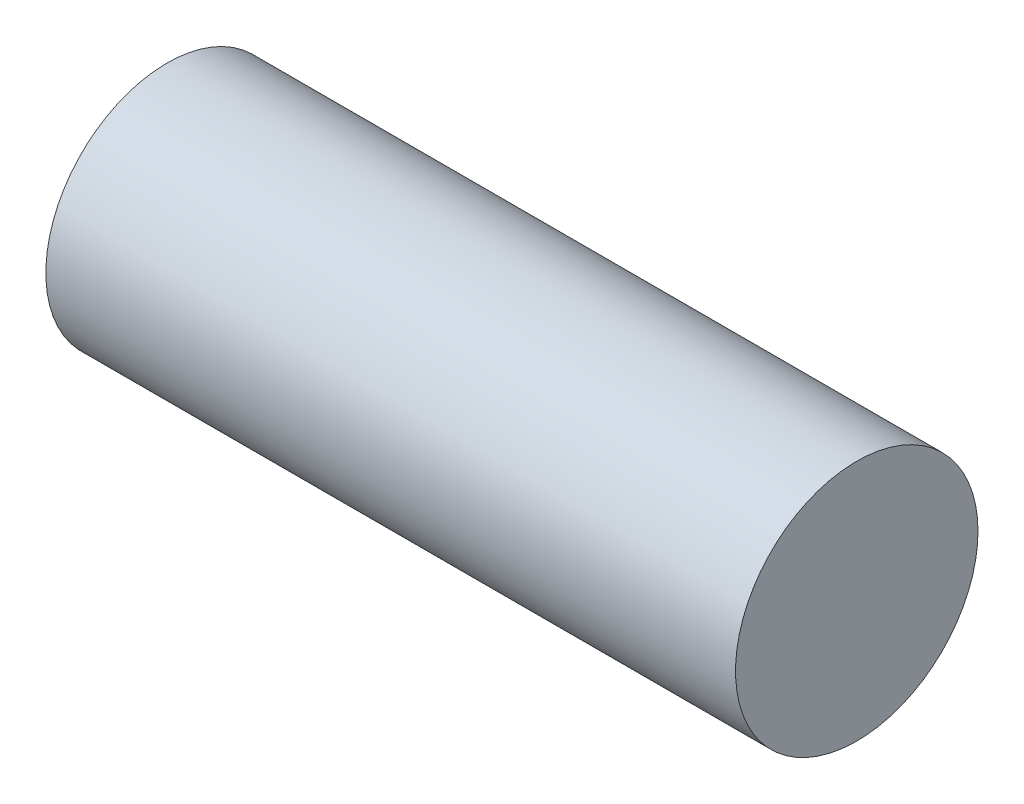
ISO-10303-21;
HEADER;
FILE_DESCRIPTION(('STEP AP214'),'2;1');
FILE_NAME('part.step','',(''),(''),'','','');
FILE_SCHEMA(('AUTOMOTIVE_DESIGN { 1 0 10303 214 1 1 1 1 }'));
ENDSEC;
DATA;
#1=APPLICATION_CONTEXT('core data for automotive mechanical design processes');
#2=APPLICATION_PROTOCOL_DEFINITION('international standard','automotive_design',2000,#1);
#3=PRODUCT_CONTEXT('',#1,'mechanical');
#4=PRODUCT('Part','Part','',(#3));
#5=PRODUCT_RELATED_PRODUCT_CATEGORY('part','',(#4));
#6=PRODUCT_DEFINITION_FORMATION('','',#4);
#7=PRODUCT_DEFINITION_CONTEXT('part definition',#1,'design');
#8=PRODUCT_DEFINITION('design','',#6,#7);
#9=PRODUCT_DEFINITION_SHAPE('','',#8);
#10=(LENGTH_UNIT() NAMED_UNIT(*) SI_UNIT(.MILLI.,.METRE.));
#11=(NAMED_UNIT(*) PLANE_ANGLE_UNIT() SI_UNIT($,.RADIAN.));
#12=(NAMED_UNIT(*) SI_UNIT($,.STERADIAN.) SOLID_ANGLE_UNIT());
#13=UNCERTAINTY_MEASURE_WITH_UNIT(LENGTH_MEASURE(1.E-05),#10,'distance_accuracy_value','');
#14=(GEOMETRIC_REPRESENTATION_CONTEXT(3) GLOBAL_UNCERTAINTY_ASSIGNED_CONTEXT((#13)) GLOBAL_UNIT_ASSIGNED_CONTEXT((#10,
#11,#12)) REPRESENTATION_CONTEXT('',''));
#15=CARTESIAN_POINT('',(0.,0.,0.));
#16=DIRECTION('',(0.,0.,1.));
#17=DIRECTION('',(1.,0.,0.));
#18=AXIS2_PLACEMENT_3D('',#15,#16,#17);
#19=CARTESIAN_POINT('',(25.6,25.1675074548374,38.4674097683693));
#20=DIRECTION('',(-1.,0.,0.));
#21=DIRECTION('',(0.,0.,1.));
#22=AXIS2_PLACEMENT_3D('',#19,#20,#21);
#23=CYLINDRICAL_SURFACE('',#22,4.5);
#24=CARTESIAN_POINT('',(25.6,25.1675074548374,38.4674097683693));
#25=DIRECTION('',(1.,0.,0.));
#26=DIRECTION('',(0.,0.,-1.));
#27=AXIS2_PLACEMENT_3D('',#24,#25,#26);
#28=CIRCLE('',#27,4.5);
#29=CARTESIAN_POINT('',(25.6,25.1675074548374,33.9674097683693));
#30=VERTEX_POINT('',#29);
#31=EDGE_CURVE('E10',#30,#30,#28,.T.);
#32=ORIENTED_EDGE('',*,*,#31,.F.);
#33=EDGE_LOOP('',(#32));
#34=FACE_BOUND('',#33,.T.);
#35=CARTESIAN_POINT('',(0.,25.1675074548374,38.4674097683693));
#36=DIRECTION('',(1.,0.,0.));
#37=DIRECTION('',(0.,0.,-1.));
#38=AXIS2_PLACEMENT_3D('',#35,#36,#37);
#39=CIRCLE('',#38,4.5);
#40=CARTESIAN_POINT('',(0.,25.1675074548374,33.9674097683693));
#41=VERTEX_POINT('',#40);
#42=EDGE_CURVE('E40',#41,#41,#39,.T.);
#43=ORIENTED_EDGE('',*,*,#42,.T.);
#44=EDGE_LOOP('',(#43));
#45=FACE_BOUND('',#44,.T.);
#46=ADVANCED_FACE('F37',(#34,#45),#23,.T.);
#47=CARTESIAN_POINT('',(25.6,25.1675074548374,38.4674097683693));
#48=DIRECTION('',(1.,0.,0.));
#49=DIRECTION('',(0.,0.,-1.));
#50=AXIS2_PLACEMENT_3D('',#47,#48,#49);
#51=PLANE('',#50);
#52=ORIENTED_EDGE('',*,*,#31,.T.);
#53=EDGE_LOOP('',(#52));
#54=FACE_BOUND('',#53,.T.);
#55=ADVANCED_FACE('F54',(#54),#51,.T.);
#56=CARTESIAN_POINT('',(0.,25.1675074548374,38.4674097683693));
#57=DIRECTION('',(1.,0.,0.));
#58=DIRECTION('',(0.,0.,-1.));
#59=AXIS2_PLACEMENT_3D('',#56,#57,#58);
#60=PLANE('',#59);
#61=ORIENTED_EDGE('',*,*,#42,.F.);
#62=EDGE_LOOP('',(#61));
#63=FACE_BOUND('',#62,.T.);
#64=ADVANCED_FACE('F52',(#63),#60,.F.);
#65=CLOSED_SHELL('',(#46,#55,#64));
#66=MANIFOLD_SOLID_BREP('B2',#65);
#67=ADVANCED_BREP_SHAPE_REPRESENTATION('',(#18,#66),#14);
#68=SHAPE_DEFINITION_REPRESENTATION(#9,#67);
ENDSEC;
END-ISO-10303-21;
